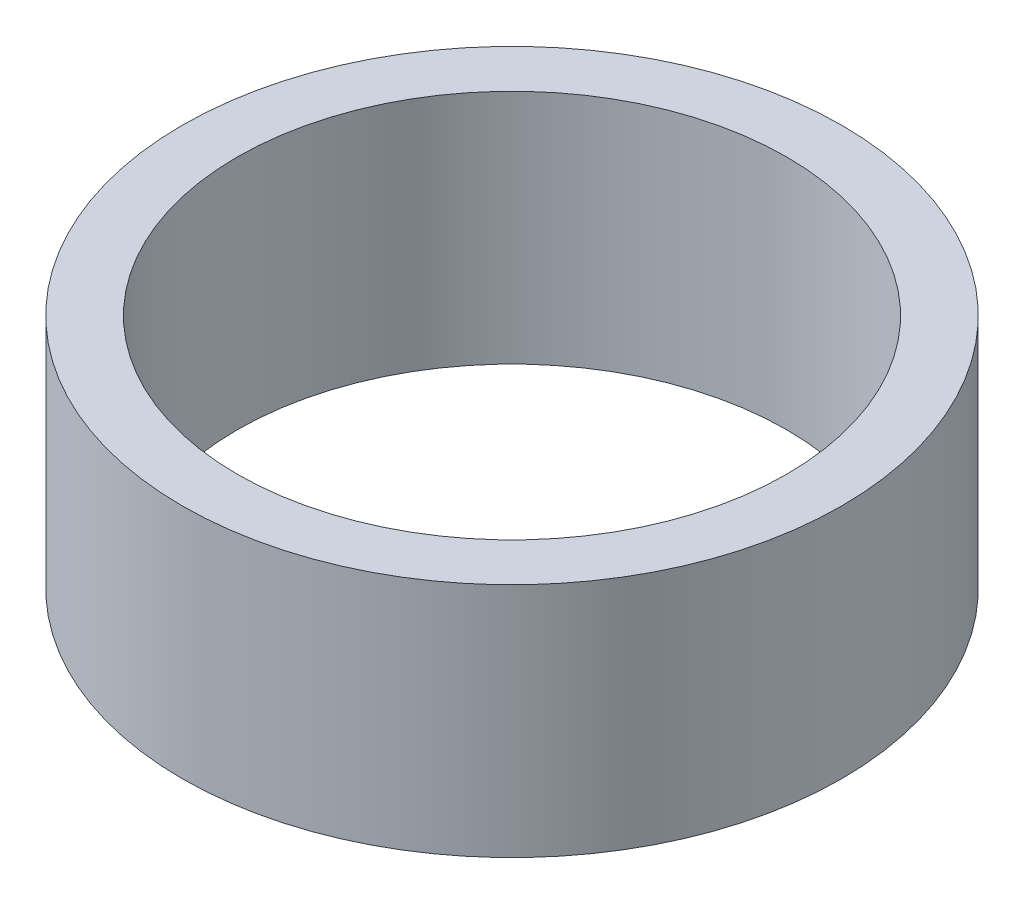
ISO-10303-21;
HEADER;
FILE_DESCRIPTION(('STEP AP214'),'2;1');
FILE_NAME('part.step','',(''),(''),'','','');
FILE_SCHEMA(('AUTOMOTIVE_DESIGN { 1 0 10303 214 1 1 1 1 }'));
ENDSEC;
DATA;
#1=APPLICATION_CONTEXT('core data for automotive mechanical design processes');
#2=APPLICATION_PROTOCOL_DEFINITION('international standard','automotive_design',2000,#1);
#3=PRODUCT_CONTEXT('',#1,'mechanical');
#4=PRODUCT('Part','Part','',(#3));
#5=PRODUCT_RELATED_PRODUCT_CATEGORY('part','',(#4));
#6=PRODUCT_DEFINITION_FORMATION('','',#4);
#7=PRODUCT_DEFINITION_CONTEXT('part definition',#1,'design');
#8=PRODUCT_DEFINITION('design','',#6,#7);
#9=PRODUCT_DEFINITION_SHAPE('','',#8);
#10=(LENGTH_UNIT() NAMED_UNIT(*) SI_UNIT(.MILLI.,.METRE.));
#11=(NAMED_UNIT(*) PLANE_ANGLE_UNIT() SI_UNIT($,.RADIAN.));
#12=(NAMED_UNIT(*) SI_UNIT($,.STERADIAN.) SOLID_ANGLE_UNIT());
#13=UNCERTAINTY_MEASURE_WITH_UNIT(LENGTH_MEASURE(1.E-05),#10,'distance_accuracy_value','');
#14=(GEOMETRIC_REPRESENTATION_CONTEXT(3) GLOBAL_UNCERTAINTY_ASSIGNED_CONTEXT((#13)) GLOBAL_UNIT_ASSIGNED_CONTEXT((#10,
#11,#12)) REPRESENTATION_CONTEXT('',''));
#15=CARTESIAN_POINT('',(0.,0.,0.));
#16=DIRECTION('',(0.,0.,1.));
#17=DIRECTION('',(1.,0.,0.));
#18=AXIS2_PLACEMENT_3D('',#15,#16,#17);
#19=CARTESIAN_POINT('',(0.,43.,0.));
#20=DIRECTION('',(0.,-1.,0.));
#21=DIRECTION('',(0.,0.,-1.));
#22=AXIS2_PLACEMENT_3D('',#19,#20,#21);
#23=CYLINDRICAL_SURFACE('',#22,60.);
#24=CARTESIAN_POINT('',(0.,43.,0.));
#25=DIRECTION('',(0.,1.,0.));
#26=DIRECTION('',(0.,0.,1.));
#27=AXIS2_PLACEMENT_3D('',#24,#25,#26);
#28=CIRCLE('',#27,60.);
#29=CARTESIAN_POINT('',(0.,43.,60.));
#30=VERTEX_POINT('',#29);
#31=EDGE_CURVE('E10',#30,#30,#28,.T.);
#32=ORIENTED_EDGE('',*,*,#31,.F.);
#33=EDGE_LOOP('',(#32));
#34=FACE_BOUND('',#33,.T.);
#35=CARTESIAN_POINT('',(0.,0.,0.));
#36=DIRECTION('',(0.,1.,0.));
#37=DIRECTION('',(0.,0.,1.));
#38=AXIS2_PLACEMENT_3D('',#35,#36,#37);
#39=CIRCLE('',#38,60.);
#40=CARTESIAN_POINT('',(0.,0.,60.));
#41=VERTEX_POINT('',#40);
#42=EDGE_CURVE('E46',#41,#41,#39,.T.);
#43=ORIENTED_EDGE('',*,*,#42,.T.);
#44=EDGE_LOOP('',(#43));
#45=FACE_BOUND('',#44,.T.);
#46=ADVANCED_FACE('F43',(#34,#45),#23,.T.);
#47=CARTESIAN_POINT('',(0.,43.,0.));
#48=DIRECTION('',(0.,1.,0.));
#49=DIRECTION('',(0.,0.,1.));
#50=AXIS2_PLACEMENT_3D('',#47,#48,#49);
#51=PLANE('',#50);
#52=CARTESIAN_POINT('',(0.,43.,0.));
#53=DIRECTION('',(0.,1.,0.));
#54=DIRECTION('',(0.,0.,1.));
#55=AXIS2_PLACEMENT_3D('',#52,#53,#54);
#56=CIRCLE('',#55,50.);
#57=CARTESIAN_POINT('',(0.,43.,50.));
#58=VERTEX_POINT('',#57);
#59=EDGE_CURVE('E55',#58,#58,#56,.F.);
#60=ORIENTED_EDGE('',*,*,#59,.T.);
#61=EDGE_LOOP('',(#60));
#62=FACE_BOUND('',#61,.T.);
#63=ORIENTED_EDGE('',*,*,#31,.T.);
#64=EDGE_LOOP('',(#63));
#65=FACE_BOUND('',#64,.T.);
#66=ADVANCED_FACE('F71',(#62,#65),#51,.T.);
#67=CARTESIAN_POINT('',(0.,0.,0.));
#68=DIRECTION('',(0.,1.,0.));
#69=DIRECTION('',(0.,0.,1.));
#70=AXIS2_PLACEMENT_3D('',#67,#68,#69);
#71=PLANE('',#70);
#72=CARTESIAN_POINT('',(0.,0.,0.));
#73=DIRECTION('',(0.,-1.,0.));
#74=DIRECTION('',(0.,0.,-1.));
#75=AXIS2_PLACEMENT_3D('',#72,#73,#74);
#76=CIRCLE('',#75,50.);
#77=CARTESIAN_POINT('',(0.,0.,-50.));
#78=VERTEX_POINT('',#77);
#79=EDGE_CURVE('E60',#78,#78,#76,.T.);
#80=ORIENTED_EDGE('',*,*,#79,.F.);
#81=EDGE_LOOP('',(#80));
#82=FACE_BOUND('',#81,.T.);
#83=ORIENTED_EDGE('',*,*,#42,.F.);
#84=EDGE_LOOP('',(#83));
#85=FACE_BOUND('',#84,.T.);
#86=ADVANCED_FACE('F68',(#82,#85),#71,.F.);
#87=CARTESIAN_POINT('',(0.,184.42135623731,0.));
#88=DIRECTION('',(0.,-1.,0.));
#89=DIRECTION('',(0.,0.,-1.));
#90=AXIS2_PLACEMENT_3D('',#87,#88,#89);
#91=CYLINDRICAL_SURFACE('',#90,50.);
#92=ORIENTED_EDGE('',*,*,#79,.T.);
#93=EDGE_LOOP('',(#92));
#94=FACE_BOUND('',#93,.T.);
#95=ORIENTED_EDGE('',*,*,#59,.F.);
#96=EDGE_LOOP('',(#95));
#97=FACE_BOUND('',#96,.T.);
#98=ADVANCED_FACE('F65',(#94,#97),#91,.F.);
#99=CLOSED_SHELL('',(#46,#66,#86,#98));
#100=MANIFOLD_SOLID_BREP('B2',#99);
#101=ADVANCED_BREP_SHAPE_REPRESENTATION('',(#18,#100),#14);
#102=SHAPE_DEFINITION_REPRESENTATION(#9,#101);
ENDSEC;
END-ISO-10303-21;
